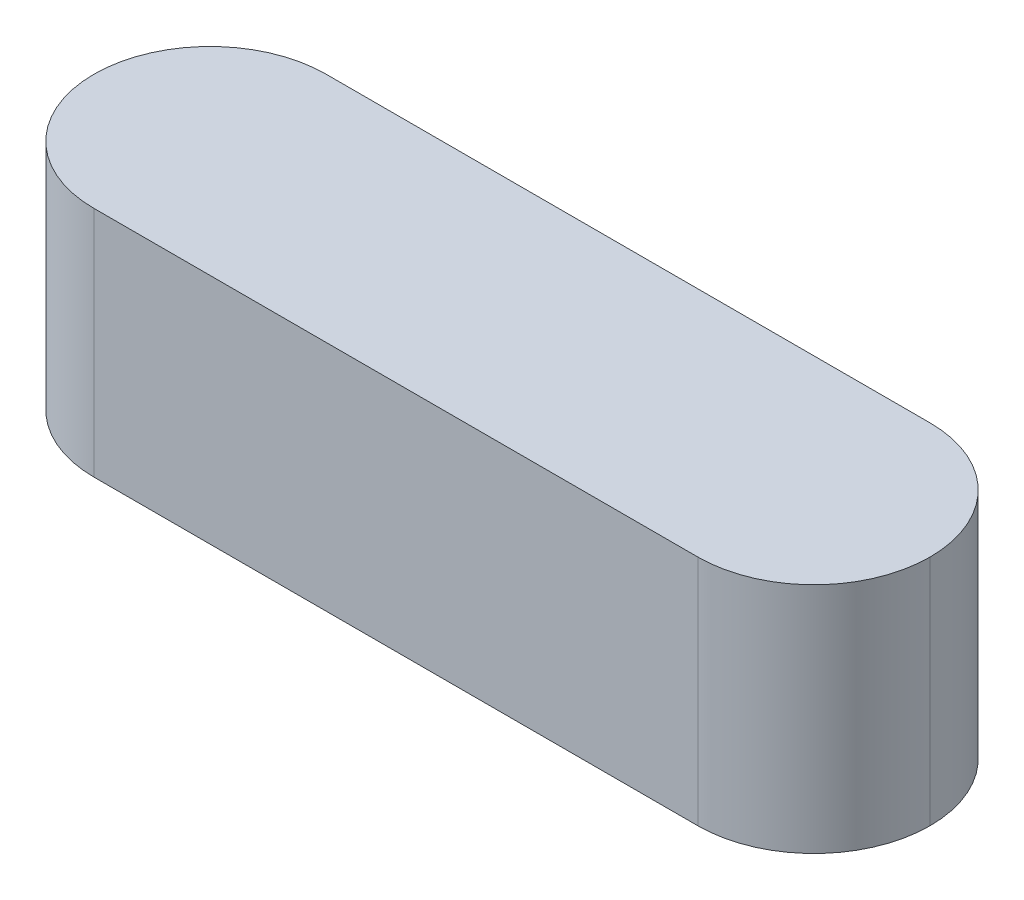
ISO-10303-21;
HEADER;
FILE_DESCRIPTION(('STEP AP214'),'2;1');
FILE_NAME('part.step','',(''),(''),'','','');
FILE_SCHEMA(('AUTOMOTIVE_DESIGN { 1 0 10303 214 1 1 1 1 }'));
ENDSEC;
DATA;
#1=APPLICATION_CONTEXT('core data for automotive mechanical design processes');
#2=APPLICATION_PROTOCOL_DEFINITION('international standard','automotive_design',2000,#1);
#3=PRODUCT_CONTEXT('',#1,'mechanical');
#4=PRODUCT('Part','Part','',(#3));
#5=PRODUCT_RELATED_PRODUCT_CATEGORY('part','',(#4));
#6=PRODUCT_DEFINITION_FORMATION('','',#4);
#7=PRODUCT_DEFINITION_CONTEXT('part definition',#1,'design');
#8=PRODUCT_DEFINITION('design','',#6,#7);
#9=PRODUCT_DEFINITION_SHAPE('','',#8);
#10=(LENGTH_UNIT() NAMED_UNIT(*) SI_UNIT(.MILLI.,.METRE.));
#11=(NAMED_UNIT(*) PLANE_ANGLE_UNIT() SI_UNIT($,.RADIAN.));
#12=(NAMED_UNIT(*) SI_UNIT($,.STERADIAN.) SOLID_ANGLE_UNIT());
#13=UNCERTAINTY_MEASURE_WITH_UNIT(LENGTH_MEASURE(1.E-05),#10,'distance_accuracy_value','');
#14=(GEOMETRIC_REPRESENTATION_CONTEXT(3) GLOBAL_UNCERTAINTY_ASSIGNED_CONTEXT((#13)) GLOBAL_UNIT_ASSIGNED_CONTEXT((#10,
#11,#12)) REPRESENTATION_CONTEXT('',''));
#15=CARTESIAN_POINT('',(0.,0.,0.));
#16=DIRECTION('',(0.,0.,1.));
#17=DIRECTION('',(1.,0.,0.));
#18=AXIS2_PLACEMENT_3D('',#15,#16,#17);
#19=CARTESIAN_POINT('',(0.,25.05,0.));
#20=DIRECTION('',(0.,0.,-1.));
#21=DIRECTION('',(-1.,0.,0.));
#22=AXIS2_PLACEMENT_3D('',#19,#20,#21);
#23=PLANE('',#22);
#24=DIRECTION('',(1.,0.,0.));
#25=VECTOR('',#24,1.);
#26=CARTESIAN_POINT('',(0.,0.,0.));
#27=LINE('',#26,#25);
#28=CARTESIAN_POINT('',(12.5,0.,0.));
#29=VERTEX_POINT('',#28);
#30=CARTESIAN_POINT('',(77.5,0.,0.));
#31=VERTEX_POINT('',#30);
#32=EDGE_CURVE('E100',#29,#31,#27,.T.);
#33=ORIENTED_EDGE('',*,*,#32,.T.);
#34=DIRECTION('',(0.,-1.,0.));
#35=VECTOR('',#34,1.);
#36=CARTESIAN_POINT('',(77.5,25.05,0.));
#37=LINE('',#36,#35);
#38=CARTESIAN_POINT('',(77.5,25.05,0.));
#39=VERTEX_POINT('',#38);
#40=EDGE_CURVE('E144',#31,#39,#37,.F.);
#41=ORIENTED_EDGE('',*,*,#40,.T.);
#42=DIRECTION('',(1.,0.,0.));
#43=VECTOR('',#42,1.);
#44=CARTESIAN_POINT('',(0.,25.05,0.));
#45=LINE('',#44,#43);
#46=CARTESIAN_POINT('',(12.5,25.05,0.));
#47=VERTEX_POINT('',#46);
#48=EDGE_CURVE('E111',#47,#39,#45,.T.);
#49=ORIENTED_EDGE('',*,*,#48,.F.);
#50=DIRECTION('',(0.,-1.,0.));
#51=VECTOR('',#50,1.);
#52=CARTESIAN_POINT('',(12.5,0.,0.));
#53=LINE('',#52,#51);
#54=EDGE_CURVE('E142',#47,#29,#53,.T.);
#55=ORIENTED_EDGE('',*,*,#54,.T.);
#56=EDGE_LOOP('',(#33,#41,#49,#55));
#57=FACE_BOUND('',#56,.T.);
#58=ADVANCED_FACE('F41',(#57),#23,.F.);
#59=CARTESIAN_POINT('',(0.,25.05,-25.));
#60=DIRECTION('',(0.,0.,-1.));
#61=DIRECTION('',(-1.,0.,0.));
#62=AXIS2_PLACEMENT_3D('',#59,#60,#61);
#63=PLANE('',#62);
#64=DIRECTION('',(1.,0.,0.));
#65=VECTOR('',#64,1.);
#66=CARTESIAN_POINT('',(0.,25.05,-25.));
#67=LINE('',#66,#65);
#68=CARTESIAN_POINT('',(12.5,25.05,-25.));
#69=VERTEX_POINT('',#68);
#70=CARTESIAN_POINT('',(77.5,25.05,-25.));
#71=VERTEX_POINT('',#70);
#72=EDGE_CURVE('E133',#69,#71,#67,.T.);
#73=ORIENTED_EDGE('',*,*,#72,.T.);
#74=DIRECTION('',(0.,-1.,0.));
#75=VECTOR('',#74,1.);
#76=CARTESIAN_POINT('',(77.5,0.,-25.));
#77=LINE('',#76,#75);
#78=CARTESIAN_POINT('',(77.5,0.,-25.));
#79=VERTEX_POINT('',#78);
#80=EDGE_CURVE('E11',#71,#79,#77,.T.);
#81=ORIENTED_EDGE('',*,*,#80,.T.);
#82=DIRECTION('',(1.,0.,0.));
#83=VECTOR('',#82,1.);
#84=CARTESIAN_POINT('',(0.,0.,-25.));
#85=LINE('',#84,#83);
#86=CARTESIAN_POINT('',(12.5,0.,-25.));
#87=VERTEX_POINT('',#86);
#88=EDGE_CURVE('E118',#87,#79,#85,.T.);
#89=ORIENTED_EDGE('',*,*,#88,.F.);
#90=DIRECTION('',(0.,-1.,0.));
#91=VECTOR('',#90,1.);
#92=CARTESIAN_POINT('',(12.5,25.05,-25.));
#93=LINE('',#92,#91);
#94=EDGE_CURVE('E50',#87,#69,#93,.F.);
#95=ORIENTED_EDGE('',*,*,#94,.T.);
#96=EDGE_LOOP('',(#73,#81,#89,#95));
#97=FACE_BOUND('',#96,.T.);
#98=ADVANCED_FACE('F166',(#97),#63,.T.);
#99=CARTESIAN_POINT('',(0.,25.05,0.));
#100=DIRECTION('',(0.,-1.,0.));
#101=DIRECTION('',(0.,0.,-1.));
#102=AXIS2_PLACEMENT_3D('',#99,#100,#101);
#103=PLANE('',#102);
#104=ORIENTED_EDGE('',*,*,#48,.T.);
#105=CARTESIAN_POINT('',(77.5,25.05,-12.5));
#106=DIRECTION('',(0.,-1.,0.));
#107=DIRECTION('',(0.,0.,-1.));
#108=AXIS2_PLACEMENT_3D('',#105,#106,#107);
#109=CIRCLE('',#108,12.5);
#110=CARTESIAN_POINT('',(90.,25.05,-12.5));
#111=VERTEX_POINT('',#110);
#112=EDGE_CURVE('E151',#39,#111,#109,.F.);
#113=ORIENTED_EDGE('',*,*,#112,.T.);
#114=CARTESIAN_POINT('',(77.5,25.05,-12.5));
#115=DIRECTION('',(0.,-1.,0.));
#116=DIRECTION('',(0.,0.,-1.));
#117=AXIS2_PLACEMENT_3D('',#114,#115,#116);
#118=CIRCLE('',#117,12.5);
#119=EDGE_CURVE('E58',#111,#71,#118,.F.);
#120=ORIENTED_EDGE('',*,*,#119,.T.);
#121=ORIENTED_EDGE('',*,*,#72,.F.);
#122=CARTESIAN_POINT('',(12.5,25.05,-12.5));
#123=DIRECTION('',(0.,-1.,0.));
#124=DIRECTION('',(0.,0.,-1.));
#125=AXIS2_PLACEMENT_3D('',#122,#123,#124);
#126=CIRCLE('',#125,12.5);
#127=CARTESIAN_POINT('',(0.,25.05,-12.5));
#128=VERTEX_POINT('',#127);
#129=EDGE_CURVE('E147',#69,#128,#126,.F.);
#130=ORIENTED_EDGE('',*,*,#129,.T.);
#131=CARTESIAN_POINT('',(12.5,25.05,-12.5));
#132=DIRECTION('',(0.,-1.,0.));
#133=DIRECTION('',(0.,0.,-1.));
#134=AXIS2_PLACEMENT_3D('',#131,#132,#133);
#135=CIRCLE('',#134,12.5);
#136=EDGE_CURVE('E114',#128,#47,#135,.F.);
#137=ORIENTED_EDGE('',*,*,#136,.T.);
#138=EDGE_LOOP('',(#104,#113,#120,#121,#130,#137));
#139=FACE_BOUND('',#138,.T.);
#140=ADVANCED_FACE('F153',(#139),#103,.F.);
#141=CARTESIAN_POINT('',(0.,0.,0.));
#142=DIRECTION('',(0.,-1.,0.));
#143=DIRECTION('',(0.,0.,-1.));
#144=AXIS2_PLACEMENT_3D('',#141,#142,#143);
#145=PLANE('',#144);
#146=CARTESIAN_POINT('',(67.5,0.,-12.5));
#147=DIRECTION('',(0.,-1.,0.));
#148=DIRECTION('',(0.,0.,-1.));
#149=AXIS2_PLACEMENT_3D('',#146,#147,#148);
#150=CIRCLE('',#149,1.5);
#151=CARTESIAN_POINT('',(67.5,0.,-14.));
#152=VERTEX_POINT('',#151);
#153=EDGE_CURVE('E120',#152,#152,#150,.T.);
#154=ORIENTED_EDGE('',*,*,#153,.F.);
#155=EDGE_LOOP('',(#154));
#156=FACE_BOUND('',#155,.T.);
#157=CARTESIAN_POINT('',(22.5,0.,-12.5));
#158=DIRECTION('',(0.,-1.,0.));
#159=DIRECTION('',(0.,0.,-1.));
#160=AXIS2_PLACEMENT_3D('',#157,#158,#159);
#161=CIRCLE('',#160,1.5);
#162=CARTESIAN_POINT('',(22.5,0.,-14.));
#163=VERTEX_POINT('',#162);
#164=EDGE_CURVE('E125',#163,#163,#161,.T.);
#165=ORIENTED_EDGE('',*,*,#164,.F.);
#166=EDGE_LOOP('',(#165));
#167=FACE_BOUND('',#166,.T.);
#168=CARTESIAN_POINT('',(77.5,0.,-12.5));
#169=DIRECTION('',(0.,-1.,0.));
#170=DIRECTION('',(0.,0.,-1.));
#171=AXIS2_PLACEMENT_3D('',#168,#169,#170);
#172=CIRCLE('',#171,12.5);
#173=CARTESIAN_POINT('',(90.,0.,-12.5));
#174=VERTEX_POINT('',#173);
#175=EDGE_CURVE('E105',#79,#174,#172,.T.);
#176=ORIENTED_EDGE('',*,*,#175,.T.);
#177=CARTESIAN_POINT('',(77.5,0.,-12.5));
#178=DIRECTION('',(0.,-1.,0.));
#179=DIRECTION('',(0.,0.,-1.));
#180=AXIS2_PLACEMENT_3D('',#177,#178,#179);
#181=CIRCLE('',#180,12.5);
#182=EDGE_CURVE('E140',#174,#31,#181,.T.);
#183=ORIENTED_EDGE('',*,*,#182,.T.);
#184=ORIENTED_EDGE('',*,*,#32,.F.);
#185=CARTESIAN_POINT('',(12.5,0.,-12.5));
#186=DIRECTION('',(0.,-1.,0.));
#187=DIRECTION('',(0.,0.,-1.));
#188=AXIS2_PLACEMENT_3D('',#185,#186,#187);
#189=CIRCLE('',#188,12.5);
#190=CARTESIAN_POINT('',(0.,0.,-12.5));
#191=VERTEX_POINT('',#190);
#192=EDGE_CURVE('E94',#29,#191,#189,.T.);
#193=ORIENTED_EDGE('',*,*,#192,.T.);
#194=CARTESIAN_POINT('',(12.5,0.,-12.5));
#195=DIRECTION('',(0.,-1.,0.));
#196=DIRECTION('',(0.,0.,-1.));
#197=AXIS2_PLACEMENT_3D('',#194,#195,#196);
#198=CIRCLE('',#197,12.5);
#199=EDGE_CURVE('E98',#191,#87,#198,.T.);
#200=ORIENTED_EDGE('',*,*,#199,.T.);
#201=ORIENTED_EDGE('',*,*,#88,.T.);
#202=EDGE_LOOP('',(#176,#183,#184,#193,#200,#201));
#203=FACE_BOUND('',#202,.T.);
#204=ADVANCED_FACE('F96',(#156,#167,#203),#145,.T.);
#205=CARTESIAN_POINT('',(77.5,25.05,-12.5));
#206=DIRECTION('',(0.,1.,0.));
#207=DIRECTION('',(0.,0.,1.));
#208=AXIS2_PLACEMENT_3D('',#205,#206,#207);
#209=CYLINDRICAL_SURFACE('',#208,12.5);
#210=ORIENTED_EDGE('',*,*,#80,.F.);
#211=ORIENTED_EDGE('',*,*,#119,.F.);
#212=DIRECTION('',(0.,-1.,0.));
#213=VECTOR('',#212,1.);
#214=CARTESIAN_POINT('',(90.,25.05,-12.5));
#215=LINE('',#214,#213);
#216=EDGE_CURVE('E115',#174,#111,#215,.F.);
#217=ORIENTED_EDGE('',*,*,#216,.F.);
#218=ORIENTED_EDGE('',*,*,#175,.F.);
#219=EDGE_LOOP('',(#210,#211,#217,#218));
#220=FACE_BOUND('',#219,.T.);
#221=ADVANCED_FACE('F160',(#220),#209,.T.);
#222=CARTESIAN_POINT('',(77.5,25.05,-12.5));
#223=DIRECTION('',(0.,-1.,0.));
#224=DIRECTION('',(0.,0.,-1.));
#225=AXIS2_PLACEMENT_3D('',#222,#223,#224);
#226=CYLINDRICAL_SURFACE('',#225,12.5);
#227=ORIENTED_EDGE('',*,*,#112,.F.);
#228=ORIENTED_EDGE('',*,*,#40,.F.);
#229=ORIENTED_EDGE('',*,*,#182,.F.);
#230=ORIENTED_EDGE('',*,*,#216,.T.);
#231=EDGE_LOOP('',(#227,#228,#229,#230));
#232=FACE_BOUND('',#231,.T.);
#233=ADVANCED_FACE('F163',(#232),#226,.T.);
#234=CARTESIAN_POINT('',(12.5,25.05,-12.5));
#235=DIRECTION('',(0.,-1.,0.));
#236=DIRECTION('',(0.,0.,-1.));
#237=AXIS2_PLACEMENT_3D('',#234,#235,#236);
#238=CYLINDRICAL_SURFACE('',#237,12.5);
#239=DIRECTION('',(0.,-1.,0.));
#240=VECTOR('',#239,1.);
#241=CARTESIAN_POINT('',(0.,25.05,-12.5));
#242=LINE('',#241,#240);
#243=EDGE_CURVE('E45',#128,#191,#242,.T.);
#244=ORIENTED_EDGE('',*,*,#243,.F.);
#245=ORIENTED_EDGE('',*,*,#129,.F.);
#246=ORIENTED_EDGE('',*,*,#94,.F.);
#247=ORIENTED_EDGE('',*,*,#199,.F.);
#248=EDGE_LOOP('',(#244,#245,#246,#247));
#249=FACE_BOUND('',#248,.T.);
#250=ADVANCED_FACE('F43',(#249),#238,.T.);
#251=CARTESIAN_POINT('',(12.5,25.05,-12.5));
#252=DIRECTION('',(0.,1.,0.));
#253=DIRECTION('',(0.,0.,1.));
#254=AXIS2_PLACEMENT_3D('',#251,#252,#253);
#255=CYLINDRICAL_SURFACE('',#254,12.5);
#256=ORIENTED_EDGE('',*,*,#136,.F.);
#257=ORIENTED_EDGE('',*,*,#243,.T.);
#258=ORIENTED_EDGE('',*,*,#192,.F.);
#259=ORIENTED_EDGE('',*,*,#54,.F.);
#260=EDGE_LOOP('',(#256,#257,#258,#259));
#261=FACE_BOUND('',#260,.T.);
#262=ADVANCED_FACE('F113',(#261),#255,.T.);
#263=CARTESIAN_POINT('',(22.5,5.,-12.5));
#264=DIRECTION('',(0.,-1.,0.));
#265=DIRECTION('',(0.,0.,-1.));
#266=AXIS2_PLACEMENT_3D('',#263,#264,#265);
#267=CYLINDRICAL_SURFACE('',#266,1.5);
#268=CARTESIAN_POINT('',(22.5,5.,-12.5));
#269=DIRECTION('',(0.,-1.,0.));
#270=DIRECTION('',(0.,0.,-1.));
#271=AXIS2_PLACEMENT_3D('',#268,#269,#270);
#272=CIRCLE('',#271,1.5);
#273=CARTESIAN_POINT('',(22.5,5.,-14.));
#274=VERTEX_POINT('',#273);
#275=EDGE_CURVE('E130',#274,#274,#272,.T.);
#276=ORIENTED_EDGE('',*,*,#275,.F.);
#277=EDGE_LOOP('',(#276));
#278=FACE_BOUND('',#277,.T.);
#279=ORIENTED_EDGE('',*,*,#164,.T.);
#280=EDGE_LOOP('',(#279));
#281=FACE_BOUND('',#280,.T.);
#282=ADVANCED_FACE('F179',(#278,#281),#267,.F.);
#283=CARTESIAN_POINT('',(22.5,5.,-12.5));
#284=DIRECTION('',(0.,-1.,0.));
#285=DIRECTION('',(0.,0.,-1.));
#286=AXIS2_PLACEMENT_3D('',#283,#284,#285);
#287=PLANE('',#286);
#288=ORIENTED_EDGE('',*,*,#275,.T.);
#289=EDGE_LOOP('',(#288));
#290=FACE_BOUND('',#289,.T.);
#291=ADVANCED_FACE('F185',(#290),#287,.T.);
#292=CARTESIAN_POINT('',(67.5,5.,-12.5));
#293=DIRECTION('',(0.,-1.,0.));
#294=DIRECTION('',(0.,0.,-1.));
#295=AXIS2_PLACEMENT_3D('',#292,#293,#294);
#296=CYLINDRICAL_SURFACE('',#295,1.5);
#297=CARTESIAN_POINT('',(67.5,5.,-12.5));
#298=DIRECTION('',(0.,-1.,0.));
#299=DIRECTION('',(0.,0.,-1.));
#300=AXIS2_PLACEMENT_3D('',#297,#298,#299);
#301=CIRCLE('',#300,1.5);
#302=CARTESIAN_POINT('',(67.5,5.,-14.));
#303=VERTEX_POINT('',#302);
#304=EDGE_CURVE('E116',#303,#303,#301,.T.);
#305=ORIENTED_EDGE('',*,*,#304,.F.);
#306=EDGE_LOOP('',(#305));
#307=FACE_BOUND('',#306,.T.);
#308=ORIENTED_EDGE('',*,*,#153,.T.);
#309=EDGE_LOOP('',(#308));
#310=FACE_BOUND('',#309,.T.);
#311=ADVANCED_FACE('F233',(#307,#310),#296,.F.);
#312=CARTESIAN_POINT('',(67.5,5.,-12.5));
#313=DIRECTION('',(0.,-1.,0.));
#314=DIRECTION('',(0.,0.,-1.));
#315=AXIS2_PLACEMENT_3D('',#312,#313,#314);
#316=PLANE('',#315);
#317=ORIENTED_EDGE('',*,*,#304,.T.);
#318=EDGE_LOOP('',(#317));
#319=FACE_BOUND('',#318,.T.);
#320=ADVANCED_FACE('F242',(#319),#316,.T.);
#321=CLOSED_SHELL('',(#58,#98,#140,#204,#221,#233,#250,#262,#282,#291,#311,#320));
#322=MANIFOLD_SOLID_BREP('B2',#321);
#323=ADVANCED_BREP_SHAPE_REPRESENTATION('',(#18,#322),#14);
#324=SHAPE_DEFINITION_REPRESENTATION(#9,#323);
ENDSEC;
END-ISO-10303-21;
